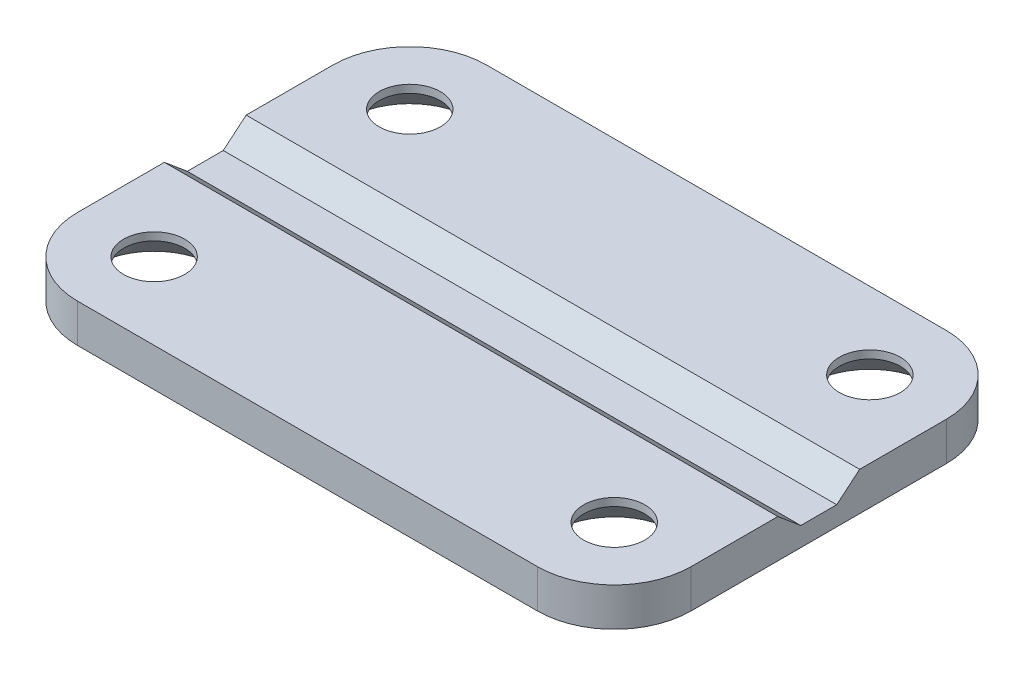
ISO-10303-21;
HEADER;
FILE_DESCRIPTION(('STEP AP214'),'2;1');
FILE_NAME('part.step','',(''),(''),'','','');
FILE_SCHEMA(('AUTOMOTIVE_DESIGN { 1 0 10303 214 1 1 1 1 }'));
ENDSEC;
DATA;
#1=APPLICATION_CONTEXT('core data for automotive mechanical design processes');
#2=APPLICATION_PROTOCOL_DEFINITION('international standard','automotive_design',2000,#1);
#3=PRODUCT_CONTEXT('',#1,'mechanical');
#4=PRODUCT('Part','Part','',(#3));
#5=PRODUCT_RELATED_PRODUCT_CATEGORY('part','',(#4));
#6=PRODUCT_DEFINITION_FORMATION('','',#4);
#7=PRODUCT_DEFINITION_CONTEXT('part definition',#1,'design');
#8=PRODUCT_DEFINITION('design','',#6,#7);
#9=PRODUCT_DEFINITION_SHAPE('','',#8);
#10=(LENGTH_UNIT() NAMED_UNIT(*) SI_UNIT(.MILLI.,.METRE.));
#11=(NAMED_UNIT(*) PLANE_ANGLE_UNIT() SI_UNIT($,.RADIAN.));
#12=(NAMED_UNIT(*) SI_UNIT($,.STERADIAN.) SOLID_ANGLE_UNIT());
#13=UNCERTAINTY_MEASURE_WITH_UNIT(LENGTH_MEASURE(1.E-05),#10,'distance_accuracy_value','');
#14=(GEOMETRIC_REPRESENTATION_CONTEXT(3) GLOBAL_UNCERTAINTY_ASSIGNED_CONTEXT((#13)) GLOBAL_UNIT_ASSIGNED_CONTEXT((#10,
#11,#12)) REPRESENTATION_CONTEXT('',''));
#15=CARTESIAN_POINT('',(0.,0.,0.));
#16=DIRECTION('',(0.,0.,1.));
#17=DIRECTION('',(1.,0.,0.));
#18=AXIS2_PLACEMENT_3D('',#15,#16,#17);
#19=CARTESIAN_POINT('',(19.05,0.,12.7));
#20=DIRECTION('',(0.,0.,-1.));
#21=DIRECTION('',(-1.,0.,0.));
#22=AXIS2_PLACEMENT_3D('',#19,#20,#21);
#23=PLANE('',#22);
#24=DIRECTION('',(-1.,0.,0.));
#25=VECTOR('',#24,1.);
#26=CARTESIAN_POINT('',(19.05,0.,12.7));
#27=LINE('',#26,#25);
#28=CARTESIAN_POINT('',(14.2748,0.,12.7));
#29=VERTEX_POINT('',#28);
#30=CARTESIAN_POINT('',(-14.2748,0.,12.7));
#31=VERTEX_POINT('',#30);
#32=EDGE_CURVE('E187',#29,#31,#27,.T.);
#33=ORIENTED_EDGE('',*,*,#32,.F.);
#34=DIRECTION('',(0.,-1.,0.));
#35=VECTOR('',#34,1.);
#36=CARTESIAN_POINT('',(14.2748,0.,12.7));
#37=LINE('',#36,#35);
#38=CARTESIAN_POINT('',(14.2748,2.3876,12.7));
#39=VERTEX_POINT('',#38);
#40=EDGE_CURVE('E214',#29,#39,#37,.F.);
#41=ORIENTED_EDGE('',*,*,#40,.T.);
#42=DIRECTION('',(-1.,0.,0.));
#43=VECTOR('',#42,1.);
#44=CARTESIAN_POINT('',(19.05,2.3876,12.7));
#45=LINE('',#44,#43);
#46=CARTESIAN_POINT('',(-14.2748,2.3876,12.7));
#47=VERTEX_POINT('',#46);
#48=EDGE_CURVE('E160',#39,#47,#45,.T.);
#49=ORIENTED_EDGE('',*,*,#48,.T.);
#50=DIRECTION('',(0.,-1.,0.));
#51=VECTOR('',#50,1.);
#52=CARTESIAN_POINT('',(-14.2748,0.,12.7));
#53=LINE('',#52,#51);
#54=EDGE_CURVE('E211',#47,#31,#53,.T.);
#55=ORIENTED_EDGE('',*,*,#54,.T.);
#56=EDGE_LOOP('',(#33,#41,#49,#55));
#57=FACE_BOUND('',#56,.T.);
#58=ADVANCED_FACE('F32',(#57),#23,.F.);
#59=CARTESIAN_POINT('',(19.05,0.,12.7));
#60=DIRECTION('',(0.,1.,0.));
#61=DIRECTION('',(0.,0.,1.));
#62=AXIS2_PLACEMENT_3D('',#59,#60,#61);
#63=PLANE('',#62);
#64=CARTESIAN_POINT('',(-14.2875,0.,-7.9375));
#65=DIRECTION('',(0.,1.,0.));
#66=DIRECTION('',(0.,0.,1.));
#67=AXIS2_PLACEMENT_3D('',#64,#65,#66);
#68=CIRCLE('',#67,3.7973);
#69=CARTESIAN_POINT('',(-14.2875,0.,-4.1402));
#70=VERTEX_POINT('',#69);
#71=EDGE_CURVE('E231',#70,#70,#68,.T.);
#72=ORIENTED_EDGE('',*,*,#71,.T.);
#73=EDGE_LOOP('',(#72));
#74=FACE_BOUND('',#73,.T.);
#75=CARTESIAN_POINT('',(14.2875,0.,-7.9375));
#76=DIRECTION('',(0.,1.,0.));
#77=DIRECTION('',(0.,0.,1.));
#78=AXIS2_PLACEMENT_3D('',#75,#76,#77);
#79=CIRCLE('',#78,3.7973);
#80=CARTESIAN_POINT('',(14.2875,0.,-4.1402));
#81=VERTEX_POINT('',#80);
#82=EDGE_CURVE('E228',#81,#81,#79,.T.);
#83=ORIENTED_EDGE('',*,*,#82,.T.);
#84=EDGE_LOOP('',(#83));
#85=FACE_BOUND('',#84,.T.);
#86=CARTESIAN_POINT('',(14.2875,0.,7.9375));
#87=DIRECTION('',(0.,1.,0.));
#88=DIRECTION('',(0.,0.,1.));
#89=AXIS2_PLACEMENT_3D('',#86,#87,#88);
#90=CIRCLE('',#89,3.7973);
#91=CARTESIAN_POINT('',(14.2875,0.,11.7348));
#92=VERTEX_POINT('',#91);
#93=EDGE_CURVE('E225',#92,#92,#90,.T.);
#94=ORIENTED_EDGE('',*,*,#93,.T.);
#95=EDGE_LOOP('',(#94));
#96=FACE_BOUND('',#95,.T.);
#97=CARTESIAN_POINT('',(-14.2875,0.,7.9375));
#98=DIRECTION('',(0.,1.,0.));
#99=DIRECTION('',(0.,0.,1.));
#100=AXIS2_PLACEMENT_3D('',#97,#98,#99);
#101=CIRCLE('',#100,3.7973);
#102=CARTESIAN_POINT('',(-14.2875,0.,11.7348));
#103=VERTEX_POINT('',#102);
#104=EDGE_CURVE('E222',#103,#103,#101,.T.);
#105=ORIENTED_EDGE('',*,*,#104,.T.);
#106=EDGE_LOOP('',(#105));
#107=FACE_BOUND('',#106,.T.);
#108=DIRECTION('',(-1.,0.,0.));
#109=VECTOR('',#108,1.);
#110=CARTESIAN_POINT('',(19.05,0.,-12.7));
#111=LINE('',#110,#109);
#112=CARTESIAN_POINT('',(14.2748,0.,-12.7));
#113=VERTEX_POINT('',#112);
#114=CARTESIAN_POINT('',(-14.2748,0.,-12.7));
#115=VERTEX_POINT('',#114);
#116=EDGE_CURVE('E184',#113,#115,#111,.T.);
#117=ORIENTED_EDGE('',*,*,#116,.F.);
#118=CARTESIAN_POINT('',(14.2748,0.,-7.9248));
#119=DIRECTION('',(0.,1.,0.));
#120=DIRECTION('',(0.,0.,1.));
#121=AXIS2_PLACEMENT_3D('',#118,#119,#120);
#122=CIRCLE('',#121,4.7752);
#123=CARTESIAN_POINT('',(19.05,0.,-7.9248));
#124=VERTEX_POINT('',#123);
#125=EDGE_CURVE('E209',#113,#124,#122,.F.);
#126=ORIENTED_EDGE('',*,*,#125,.T.);
#127=DIRECTION('',(0.,0.,-1.));
#128=VECTOR('',#127,1.);
#129=CARTESIAN_POINT('',(19.05,0.,12.7));
#130=LINE('',#129,#128);
#131=CARTESIAN_POINT('',(19.05,0.,7.9248));
#132=VERTEX_POINT('',#131);
#133=EDGE_CURVE('E134',#132,#124,#130,.T.);
#134=ORIENTED_EDGE('',*,*,#133,.F.);
#135=CARTESIAN_POINT('',(14.2748,0.,7.9248));
#136=DIRECTION('',(0.,1.,0.));
#137=DIRECTION('',(0.,0.,1.));
#138=AXIS2_PLACEMENT_3D('',#135,#136,#137);
#139=CIRCLE('',#138,4.7752);
#140=EDGE_CURVE('E207',#132,#29,#139,.F.);
#141=ORIENTED_EDGE('',*,*,#140,.T.);
#142=ORIENTED_EDGE('',*,*,#32,.T.);
#143=CARTESIAN_POINT('',(-14.2748,0.,7.9248));
#144=DIRECTION('',(0.,1.,0.));
#145=DIRECTION('',(0.,0.,1.));
#146=AXIS2_PLACEMENT_3D('',#143,#144,#145);
#147=CIRCLE('',#146,4.7752);
#148=CARTESIAN_POINT('',(-19.05,0.,7.9248));
#149=VERTEX_POINT('',#148);
#150=EDGE_CURVE('E203',#31,#149,#147,.F.);
#151=ORIENTED_EDGE('',*,*,#150,.T.);
#152=DIRECTION('',(0.,0.,-1.));
#153=VECTOR('',#152,1.);
#154=CARTESIAN_POINT('',(-19.05,0.,12.7));
#155=LINE('',#154,#153);
#156=CARTESIAN_POINT('',(-19.05,0.,-7.9248));
#157=VERTEX_POINT('',#156);
#158=EDGE_CURVE('E161',#149,#157,#155,.T.);
#159=ORIENTED_EDGE('',*,*,#158,.T.);
#160=CARTESIAN_POINT('',(-14.2748,0.,-7.9248));
#161=DIRECTION('',(0.,1.,0.));
#162=DIRECTION('',(0.,0.,1.));
#163=AXIS2_PLACEMENT_3D('',#160,#161,#162);
#164=CIRCLE('',#163,4.7752);
#165=EDGE_CURVE('E205',#157,#115,#164,.F.);
#166=ORIENTED_EDGE('',*,*,#165,.T.);
#167=EDGE_LOOP('',(#117,#126,#134,#141,#142,#151,#159,#166));
#168=FACE_BOUND('',#167,.T.);
#169=ADVANCED_FACE('F251',(#74,#85,#96,#107,#168),#63,.F.);
#170=CARTESIAN_POINT('',(19.05,0.,-12.7));
#171=DIRECTION('',(0.,0.,1.));
#172=DIRECTION('',(1.,0.,0.));
#173=AXIS2_PLACEMENT_3D('',#170,#171,#172);
#174=PLANE('',#173);
#175=DIRECTION('',(-1.,0.,0.));
#176=VECTOR('',#175,1.);
#177=CARTESIAN_POINT('',(19.05,2.3876,-12.7));
#178=LINE('',#177,#176);
#179=CARTESIAN_POINT('',(14.2748,2.3876,-12.7));
#180=VERTEX_POINT('',#179);
#181=CARTESIAN_POINT('',(-14.2748,2.3876,-12.7));
#182=VERTEX_POINT('',#181);
#183=EDGE_CURVE('E144',#180,#182,#178,.T.);
#184=ORIENTED_EDGE('',*,*,#183,.F.);
#185=DIRECTION('',(0.,1.,0.));
#186=VECTOR('',#185,1.);
#187=CARTESIAN_POINT('',(14.2748,0.,-12.7));
#188=LINE('',#187,#186);
#189=EDGE_CURVE('E201',#180,#113,#188,.F.);
#190=ORIENTED_EDGE('',*,*,#189,.T.);
#191=ORIENTED_EDGE('',*,*,#116,.T.);
#192=DIRECTION('',(0.,1.,0.));
#193=VECTOR('',#192,1.);
#194=CARTESIAN_POINT('',(-14.2748,2.3876,-12.7));
#195=LINE('',#194,#193);
#196=EDGE_CURVE('E198',#115,#182,#195,.T.);
#197=ORIENTED_EDGE('',*,*,#196,.T.);
#198=EDGE_LOOP('',(#184,#190,#191,#197));
#199=FACE_BOUND('',#198,.T.);
#200=ADVANCED_FACE('F254',(#199),#174,.F.);
#201=CARTESIAN_POINT('',(19.05,2.3876,-2.54));
#202=DIRECTION('',(0.,-1.,0.));
#203=DIRECTION('',(0.,0.,-1.));
#204=AXIS2_PLACEMENT_3D('',#201,#202,#203);
#205=PLANE('',#204);
#206=DIRECTION('',(0.,0.,1.));
#207=VECTOR('',#206,1.);
#208=CARTESIAN_POINT('',(19.05,2.3876,-2.54));
#209=LINE('',#208,#207);
#210=CARTESIAN_POINT('',(19.05,2.3876,-7.9248));
#211=VERTEX_POINT('',#210);
#212=CARTESIAN_POINT('',(19.05,2.3876,-2.54));
#213=VERTEX_POINT('',#212);
#214=EDGE_CURVE('E124',#211,#213,#209,.T.);
#215=ORIENTED_EDGE('',*,*,#214,.F.);
#216=CARTESIAN_POINT('',(14.2748,2.3876,-7.9248));
#217=DIRECTION('',(0.,-1.,0.));
#218=DIRECTION('',(0.,0.,-1.));
#219=AXIS2_PLACEMENT_3D('',#216,#217,#218);
#220=CIRCLE('',#219,4.7752);
#221=EDGE_CURVE('E196',#211,#180,#220,.F.);
#222=ORIENTED_EDGE('',*,*,#221,.T.);
#223=ORIENTED_EDGE('',*,*,#183,.T.);
#224=CARTESIAN_POINT('',(-14.2748,2.3876,-7.9248));
#225=DIRECTION('',(0.,-1.,0.));
#226=DIRECTION('',(0.,0.,-1.));
#227=AXIS2_PLACEMENT_3D('',#224,#225,#226);
#228=CIRCLE('',#227,4.7752);
#229=CARTESIAN_POINT('',(-19.05,2.3876,-7.9248));
#230=VERTEX_POINT('',#229);
#231=EDGE_CURVE('E194',#182,#230,#228,.F.);
#232=ORIENTED_EDGE('',*,*,#231,.T.);
#233=DIRECTION('',(0.,0.,1.));
#234=VECTOR('',#233,1.);
#235=CARTESIAN_POINT('',(-19.05,2.3876,-2.54));
#236=LINE('',#235,#234);
#237=CARTESIAN_POINT('',(-19.05,2.3876,-2.54));
#238=VERTEX_POINT('',#237);
#239=EDGE_CURVE('E141',#230,#238,#236,.T.);
#240=ORIENTED_EDGE('',*,*,#239,.T.);
#241=DIRECTION('',(-1.,0.,0.));
#242=VECTOR('',#241,1.);
#243=CARTESIAN_POINT('',(19.05,2.3876,-2.54));
#244=LINE('',#243,#242);
#245=EDGE_CURVE('E137',#213,#238,#244,.T.);
#246=ORIENTED_EDGE('',*,*,#245,.F.);
#247=EDGE_LOOP('',(#215,#222,#223,#232,#240,#246));
#248=FACE_BOUND('',#247,.T.);
#249=CARTESIAN_POINT('',(-14.2875,2.3876,-7.9375));
#250=DIRECTION('',(0.,1.,0.));
#251=DIRECTION('',(0.,0.,1.));
#252=AXIS2_PLACEMENT_3D('',#249,#250,#251);
#253=CIRCLE('',#252,1.89865);
#254=CARTESIAN_POINT('',(-14.2875,2.3876,-6.03885));
#255=VERTEX_POINT('',#254);
#256=EDGE_CURVE('E294',#255,#255,#253,.T.);
#257=ORIENTED_EDGE('',*,*,#256,.F.);
#258=EDGE_LOOP('',(#257));
#259=FACE_BOUND('',#258,.T.);
#260=CARTESIAN_POINT('',(14.2875,2.3876,-7.9375));
#261=DIRECTION('',(0.,1.,0.));
#262=DIRECTION('',(0.,0.,1.));
#263=AXIS2_PLACEMENT_3D('',#260,#261,#262);
#264=CIRCLE('',#263,1.89865);
#265=CARTESIAN_POINT('',(14.2875,2.3876,-6.03885));
#266=VERTEX_POINT('',#265);
#267=EDGE_CURVE('E300',#266,#266,#264,.T.);
#268=ORIENTED_EDGE('',*,*,#267,.F.);
#269=EDGE_LOOP('',(#268));
#270=FACE_BOUND('',#269,.T.);
#271=ADVANCED_FACE('F138',(#248,#259,#270),#205,.F.);
#272=CARTESIAN_POINT('',(19.05,1.1938,-1.11728456116104));
#273=DIRECTION('',(0.,-0.766044443118977,-0.642787609686541));
#274=DIRECTION('',(0.,0.642787609686541,-0.766044443118977));
#275=AXIS2_PLACEMENT_3D('',#272,#273,#274);
#276=PLANE('',#275);
#277=DIRECTION('',(0.,-0.642787609686541,0.766044443118977));
#278=VECTOR('',#277,1.);
#279=CARTESIAN_POINT('',(-19.05,1.1938,-1.11728456116104));
#280=LINE('',#279,#278);
#281=CARTESIAN_POINT('',(-19.05,1.1938,-1.11728456116104));
#282=VERTEX_POINT('',#281);
#283=EDGE_CURVE('E166',#238,#282,#280,.T.);
#284=ORIENTED_EDGE('',*,*,#283,.T.);
#285=DIRECTION('',(-1.,0.,0.));
#286=VECTOR('',#285,1.);
#287=CARTESIAN_POINT('',(19.05,1.1938,-1.11728456116104));
#288=LINE('',#287,#286);
#289=CARTESIAN_POINT('',(19.05,1.1938,-1.11728456116104));
#290=VERTEX_POINT('',#289);
#291=EDGE_CURVE('E145',#290,#282,#288,.T.);
#292=ORIENTED_EDGE('',*,*,#291,.F.);
#293=DIRECTION('',(0.,-0.642787609686541,0.766044443118977));
#294=VECTOR('',#293,1.);
#295=CARTESIAN_POINT('',(19.05,1.1938,-1.11728456116104));
#296=LINE('',#295,#294);
#297=EDGE_CURVE('E129',#213,#290,#296,.T.);
#298=ORIENTED_EDGE('',*,*,#297,.F.);
#299=ORIENTED_EDGE('',*,*,#245,.T.);
#300=EDGE_LOOP('',(#284,#292,#298,#299));
#301=FACE_BOUND('',#300,.T.);
#302=ADVANCED_FACE('F147',(#301),#276,.F.);
#303=CARTESIAN_POINT('',(19.05,1.1938,1.11728456116104));
#304=DIRECTION('',(0.,-1.,0.));
#305=DIRECTION('',(0.,0.,-1.));
#306=AXIS2_PLACEMENT_3D('',#303,#304,#305);
#307=PLANE('',#306);
#308=DIRECTION('',(0.,0.,1.));
#309=VECTOR('',#308,1.);
#310=CARTESIAN_POINT('',(-19.05,1.1938,1.11728456116104));
#311=LINE('',#310,#309);
#312=CARTESIAN_POINT('',(-19.05,1.1938,1.11728456116104));
#313=VERTEX_POINT('',#312);
#314=EDGE_CURVE('E168',#282,#313,#311,.T.);
#315=ORIENTED_EDGE('',*,*,#314,.T.);
#316=DIRECTION('',(-1.,0.,0.));
#317=VECTOR('',#316,1.);
#318=CARTESIAN_POINT('',(19.05,1.1938,1.11728456116104));
#319=LINE('',#318,#317);
#320=CARTESIAN_POINT('',(19.05,1.1938,1.11728456116104));
#321=VERTEX_POINT('',#320);
#322=EDGE_CURVE('E178',#321,#313,#319,.T.);
#323=ORIENTED_EDGE('',*,*,#322,.F.);
#324=DIRECTION('',(0.,0.,1.));
#325=VECTOR('',#324,1.);
#326=CARTESIAN_POINT('',(19.05,1.1938,1.11728456116104));
#327=LINE('',#326,#325);
#328=EDGE_CURVE('E150',#290,#321,#327,.T.);
#329=ORIENTED_EDGE('',*,*,#328,.F.);
#330=ORIENTED_EDGE('',*,*,#291,.T.);
#331=EDGE_LOOP('',(#315,#323,#329,#330));
#332=FACE_BOUND('',#331,.T.);
#333=ADVANCED_FACE('F276',(#332),#307,.F.);
#334=CARTESIAN_POINT('',(19.05,2.3876,2.54));
#335=DIRECTION('',(0.,-0.766044443118977,0.642787609686541));
#336=DIRECTION('',(0.,-0.642787609686541,-0.766044443118977));
#337=AXIS2_PLACEMENT_3D('',#334,#335,#336);
#338=PLANE('',#337);
#339=DIRECTION('',(0.,0.642787609686541,0.766044443118977));
#340=VECTOR('',#339,1.);
#341=CARTESIAN_POINT('',(-19.05,2.3876,2.54));
#342=LINE('',#341,#340);
#343=CARTESIAN_POINT('',(-19.05,2.3876,2.54));
#344=VERTEX_POINT('',#343);
#345=EDGE_CURVE('E170',#313,#344,#342,.T.);
#346=ORIENTED_EDGE('',*,*,#345,.T.);
#347=DIRECTION('',(-1.,0.,0.));
#348=VECTOR('',#347,1.);
#349=CARTESIAN_POINT('',(19.05,2.3876,2.54));
#350=LINE('',#349,#348);
#351=CARTESIAN_POINT('',(19.05,2.3876,2.54));
#352=VERTEX_POINT('',#351);
#353=EDGE_CURVE('E175',#352,#344,#350,.T.);
#354=ORIENTED_EDGE('',*,*,#353,.F.);
#355=DIRECTION('',(0.,0.642787609686541,0.766044443118977));
#356=VECTOR('',#355,1.);
#357=CARTESIAN_POINT('',(19.05,2.3876,2.54));
#358=LINE('',#357,#356);
#359=EDGE_CURVE('E152',#321,#352,#358,.T.);
#360=ORIENTED_EDGE('',*,*,#359,.F.);
#361=ORIENTED_EDGE('',*,*,#322,.T.);
#362=EDGE_LOOP('',(#346,#354,#360,#361));
#363=FACE_BOUND('',#362,.T.);
#364=ADVANCED_FACE('F283',(#363),#338,.F.);
#365=CARTESIAN_POINT('',(19.05,2.3876,12.7));
#366=DIRECTION('',(0.,-1.,0.));
#367=DIRECTION('',(0.,0.,-1.));
#368=AXIS2_PLACEMENT_3D('',#365,#366,#367);
#369=PLANE('',#368);
#370=ORIENTED_EDGE('',*,*,#48,.F.);
#371=CARTESIAN_POINT('',(14.2748,2.3876,7.9248));
#372=DIRECTION('',(0.,-1.,0.));
#373=DIRECTION('',(0.,0.,-1.));
#374=AXIS2_PLACEMENT_3D('',#371,#372,#373);
#375=CIRCLE('',#374,4.7752);
#376=CARTESIAN_POINT('',(19.05,2.3876,7.9248));
#377=VERTEX_POINT('',#376);
#378=EDGE_CURVE('E217',#39,#377,#375,.F.);
#379=ORIENTED_EDGE('',*,*,#378,.T.);
#380=DIRECTION('',(0.,0.,1.));
#381=VECTOR('',#380,1.);
#382=CARTESIAN_POINT('',(19.05,2.3876,12.7));
#383=LINE('',#382,#381);
#384=EDGE_CURVE('E157',#352,#377,#383,.T.);
#385=ORIENTED_EDGE('',*,*,#384,.F.);
#386=ORIENTED_EDGE('',*,*,#353,.T.);
#387=DIRECTION('',(0.,0.,1.));
#388=VECTOR('',#387,1.);
#389=CARTESIAN_POINT('',(-19.05,2.3876,12.7));
#390=LINE('',#389,#388);
#391=CARTESIAN_POINT('',(-19.05,2.3876,7.9248));
#392=VERTEX_POINT('',#391);
#393=EDGE_CURVE('E172',#344,#392,#390,.T.);
#394=ORIENTED_EDGE('',*,*,#393,.T.);
#395=CARTESIAN_POINT('',(-14.2748,2.3876,7.9248));
#396=DIRECTION('',(0.,-1.,0.));
#397=DIRECTION('',(0.,0.,-1.));
#398=AXIS2_PLACEMENT_3D('',#395,#396,#397);
#399=CIRCLE('',#398,4.7752);
#400=EDGE_CURVE('E54',#392,#47,#399,.F.);
#401=ORIENTED_EDGE('',*,*,#400,.T.);
#402=EDGE_LOOP('',(#370,#379,#385,#386,#394,#401));
#403=FACE_BOUND('',#402,.T.);
#404=CARTESIAN_POINT('',(-14.2875,2.3876,7.9375));
#405=DIRECTION('',(0.,1.,0.));
#406=DIRECTION('',(0.,0.,1.));
#407=AXIS2_PLACEMENT_3D('',#404,#405,#406);
#408=CIRCLE('',#407,1.89865);
#409=CARTESIAN_POINT('',(-14.2875,2.3876,9.83615));
#410=VERTEX_POINT('',#409);
#411=EDGE_CURVE('E164',#410,#410,#408,.T.);
#412=ORIENTED_EDGE('',*,*,#411,.F.);
#413=EDGE_LOOP('',(#412));
#414=FACE_BOUND('',#413,.T.);
#415=CARTESIAN_POINT('',(14.2875,2.3876,7.9375));
#416=DIRECTION('',(0.,1.,0.));
#417=DIRECTION('',(0.,0.,1.));
#418=AXIS2_PLACEMENT_3D('',#415,#416,#417);
#419=CIRCLE('',#418,1.89865);
#420=CARTESIAN_POINT('',(14.2875,2.3876,9.83615));
#421=VERTEX_POINT('',#420);
#422=EDGE_CURVE('E297',#421,#421,#419,.T.);
#423=ORIENTED_EDGE('',*,*,#422,.F.);
#424=EDGE_LOOP('',(#423));
#425=FACE_BOUND('',#424,.T.);
#426=ADVANCED_FACE('F284',(#403,#414,#425),#369,.F.);
#427=CARTESIAN_POINT('',(19.05,2.3876,12.7));
#428=DIRECTION('',(-1.,0.,0.));
#429=DIRECTION('',(0.,0.,1.));
#430=AXIS2_PLACEMENT_3D('',#427,#428,#429);
#431=PLANE('',#430);
#432=ORIENTED_EDGE('',*,*,#133,.T.);
#433=DIRECTION('',(0.,1.,0.));
#434=VECTOR('',#433,1.);
#435=CARTESIAN_POINT('',(19.05,2.3876,-7.9248));
#436=LINE('',#435,#434);
#437=EDGE_CURVE('E132',#124,#211,#436,.T.);
#438=ORIENTED_EDGE('',*,*,#437,.T.);
#439=ORIENTED_EDGE('',*,*,#214,.T.);
#440=ORIENTED_EDGE('',*,*,#297,.T.);
#441=ORIENTED_EDGE('',*,*,#328,.T.);
#442=ORIENTED_EDGE('',*,*,#359,.T.);
#443=ORIENTED_EDGE('',*,*,#384,.T.);
#444=DIRECTION('',(0.,-1.,0.));
#445=VECTOR('',#444,1.);
#446=CARTESIAN_POINT('',(19.05,2.3876,7.9248));
#447=LINE('',#446,#445);
#448=EDGE_CURVE('E190',#377,#132,#447,.T.);
#449=ORIENTED_EDGE('',*,*,#448,.T.);
#450=EDGE_LOOP('',(#432,#438,#439,#440,#441,#442,#443,#449));
#451=FACE_BOUND('',#450,.T.);
#452=ADVANCED_FACE('F127',(#451),#431,.F.);
#453=CARTESIAN_POINT('',(-19.05,2.3876,12.7));
#454=DIRECTION('',(-1.,0.,0.));
#455=DIRECTION('',(0.,0.,1.));
#456=AXIS2_PLACEMENT_3D('',#453,#454,#455);
#457=PLANE('',#456);
#458=ORIENTED_EDGE('',*,*,#239,.F.);
#459=DIRECTION('',(0.,1.,0.));
#460=VECTOR('',#459,1.);
#461=CARTESIAN_POINT('',(-19.05,0.,-7.9248));
#462=LINE('',#461,#460);
#463=EDGE_CURVE('E220',#230,#157,#462,.F.);
#464=ORIENTED_EDGE('',*,*,#463,.T.);
#465=ORIENTED_EDGE('',*,*,#158,.F.);
#466=DIRECTION('',(0.,-1.,0.));
#467=VECTOR('',#466,1.);
#468=CARTESIAN_POINT('',(-19.05,2.3876,7.9248));
#469=LINE('',#468,#467);
#470=EDGE_CURVE('E47',#149,#392,#469,.F.);
#471=ORIENTED_EDGE('',*,*,#470,.T.);
#472=ORIENTED_EDGE('',*,*,#393,.F.);
#473=ORIENTED_EDGE('',*,*,#345,.F.);
#474=ORIENTED_EDGE('',*,*,#314,.F.);
#475=ORIENTED_EDGE('',*,*,#283,.F.);
#476=EDGE_LOOP('',(#458,#464,#465,#471,#472,#473,#474,#475));
#477=FACE_BOUND('',#476,.T.);
#478=ADVANCED_FACE('F272',(#477),#457,.T.);
#479=CARTESIAN_POINT('',(-14.2875,2.3876,-7.9375));
#480=DIRECTION('',(0.,1.,0.));
#481=DIRECTION('',(0.,0.,1.));
#482=AXIS2_PLACEMENT_3D('',#479,#480,#481);
#483=CYLINDRICAL_SURFACE('',#482,1.89865);
#484=CARTESIAN_POINT('',(-14.2875,1.89865000000001,-7.9375));
#485=DIRECTION('',(0.,1.,0.));
#486=DIRECTION('',(0.,0.,1.));
#487=AXIS2_PLACEMENT_3D('',#484,#485,#486);
#488=CIRCLE('',#487,1.89865);
#489=CARTESIAN_POINT('',(-14.2875,1.89865000000001,-6.03885));
#490=VERTEX_POINT('',#489);
#491=EDGE_CURVE('E234',#490,#490,#488,.F.);
#492=ORIENTED_EDGE('',*,*,#491,.T.);
#493=EDGE_LOOP('',(#492));
#494=FACE_BOUND('',#493,.T.);
#495=ORIENTED_EDGE('',*,*,#256,.T.);
#496=EDGE_LOOP('',(#495));
#497=FACE_BOUND('',#496,.T.);
#498=ADVANCED_FACE('F352',(#494,#497),#483,.F.);
#499=CARTESIAN_POINT('',(14.2875,2.3876,7.9375));
#500=DIRECTION('',(0.,1.,0.));
#501=DIRECTION('',(0.,0.,1.));
#502=AXIS2_PLACEMENT_3D('',#499,#500,#501);
#503=CYLINDRICAL_SURFACE('',#502,1.89865);
#504=CARTESIAN_POINT('',(14.2875,1.89865000000001,7.9375));
#505=DIRECTION('',(0.,1.,0.));
#506=DIRECTION('',(0.,0.,1.));
#507=AXIS2_PLACEMENT_3D('',#504,#505,#506);
#508=CIRCLE('',#507,1.89865);
#509=CARTESIAN_POINT('',(14.2875,1.89865000000001,9.83615));
#510=VERTEX_POINT('',#509);
#511=EDGE_CURVE('E40',#510,#510,#508,.F.);
#512=ORIENTED_EDGE('',*,*,#511,.T.);
#513=EDGE_LOOP('',(#512));
#514=FACE_BOUND('',#513,.T.);
#515=ORIENTED_EDGE('',*,*,#422,.T.);
#516=EDGE_LOOP('',(#515));
#517=FACE_BOUND('',#516,.T.);
#518=ADVANCED_FACE('F242',(#514,#517),#503,.F.);
#519=CARTESIAN_POINT('',(14.2875,2.3876,-7.9375));
#520=DIRECTION('',(0.,1.,0.));
#521=DIRECTION('',(0.,0.,1.));
#522=AXIS2_PLACEMENT_3D('',#519,#520,#521);
#523=CYLINDRICAL_SURFACE('',#522,1.89865);
#524=CARTESIAN_POINT('',(14.2875,1.89865000000001,-7.9375));
#525=DIRECTION('',(0.,1.,0.));
#526=DIRECTION('',(0.,0.,1.));
#527=AXIS2_PLACEMENT_3D('',#524,#525,#526);
#528=CIRCLE('',#527,1.89865);
#529=CARTESIAN_POINT('',(14.2875,1.89865000000001,-6.03885));
#530=VERTEX_POINT('',#529);
#531=EDGE_CURVE('E237',#530,#530,#528,.F.);
#532=ORIENTED_EDGE('',*,*,#531,.T.);
#533=EDGE_LOOP('',(#532));
#534=FACE_BOUND('',#533,.T.);
#535=ORIENTED_EDGE('',*,*,#267,.T.);
#536=EDGE_LOOP('',(#535));
#537=FACE_BOUND('',#536,.T.);
#538=ADVANCED_FACE('F304',(#534,#537),#523,.F.);
#539=CARTESIAN_POINT('',(-14.2875,2.3876,7.9375));
#540=DIRECTION('',(0.,1.,0.));
#541=DIRECTION('',(0.,0.,1.));
#542=AXIS2_PLACEMENT_3D('',#539,#540,#541);
#543=CYLINDRICAL_SURFACE('',#542,1.89865);
#544=CARTESIAN_POINT('',(-14.2875,1.89865000000001,7.9375));
#545=DIRECTION('',(0.,1.,0.));
#546=DIRECTION('',(0.,0.,1.));
#547=AXIS2_PLACEMENT_3D('',#544,#545,#546);
#548=CIRCLE('',#547,1.89865);
#549=CARTESIAN_POINT('',(-14.2875,1.89865000000001,9.83615));
#550=VERTEX_POINT('',#549);
#551=EDGE_CURVE('E11',#550,#550,#548,.F.);
#552=ORIENTED_EDGE('',*,*,#551,.T.);
#553=EDGE_LOOP('',(#552));
#554=FACE_BOUND('',#553,.T.);
#555=ORIENTED_EDGE('',*,*,#411,.T.);
#556=EDGE_LOOP('',(#555));
#557=FACE_BOUND('',#556,.T.);
#558=ADVANCED_FACE('F322',(#554,#557),#543,.F.);
#559=CARTESIAN_POINT('',(14.2748,2.3876,-7.9248));
#560=DIRECTION('',(0.,1.,0.));
#561=DIRECTION('',(0.,0.,1.));
#562=AXIS2_PLACEMENT_3D('',#559,#560,#561);
#563=CYLINDRICAL_SURFACE('',#562,4.7752);
#564=ORIENTED_EDGE('',*,*,#125,.F.);
#565=ORIENTED_EDGE('',*,*,#189,.F.);
#566=ORIENTED_EDGE('',*,*,#221,.F.);
#567=ORIENTED_EDGE('',*,*,#437,.F.);
#568=EDGE_LOOP('',(#564,#565,#566,#567));
#569=FACE_BOUND('',#568,.T.);
#570=ADVANCED_FACE('F267',(#569),#563,.T.);
#571=CARTESIAN_POINT('',(14.2748,2.3876,7.9248));
#572=DIRECTION('',(0.,-1.,0.));
#573=DIRECTION('',(0.,0.,-1.));
#574=AXIS2_PLACEMENT_3D('',#571,#572,#573);
#575=CYLINDRICAL_SURFACE('',#574,4.7752);
#576=ORIENTED_EDGE('',*,*,#378,.F.);
#577=ORIENTED_EDGE('',*,*,#40,.F.);
#578=ORIENTED_EDGE('',*,*,#140,.F.);
#579=ORIENTED_EDGE('',*,*,#448,.F.);
#580=EDGE_LOOP('',(#576,#577,#578,#579));
#581=FACE_BOUND('',#580,.T.);
#582=ADVANCED_FACE('F289',(#581),#575,.T.);
#583=CARTESIAN_POINT('',(-14.2748,0.,-7.9248));
#584=DIRECTION('',(0.,-1.,0.));
#585=DIRECTION('',(0.,0.,-1.));
#586=AXIS2_PLACEMENT_3D('',#583,#584,#585);
#587=CYLINDRICAL_SURFACE('',#586,4.7752);
#588=ORIENTED_EDGE('',*,*,#165,.F.);
#589=ORIENTED_EDGE('',*,*,#463,.F.);
#590=ORIENTED_EDGE('',*,*,#231,.F.);
#591=ORIENTED_EDGE('',*,*,#196,.F.);
#592=EDGE_LOOP('',(#588,#589,#590,#591));
#593=FACE_BOUND('',#592,.T.);
#594=ADVANCED_FACE('F270',(#593),#587,.T.);
#595=CARTESIAN_POINT('',(-14.2748,0.,7.9248));
#596=DIRECTION('',(0.,1.,0.));
#597=DIRECTION('',(0.,0.,1.));
#598=AXIS2_PLACEMENT_3D('',#595,#596,#597);
#599=CYLINDRICAL_SURFACE('',#598,4.7752);
#600=ORIENTED_EDGE('',*,*,#400,.F.);
#601=ORIENTED_EDGE('',*,*,#470,.F.);
#602=ORIENTED_EDGE('',*,*,#150,.F.);
#603=ORIENTED_EDGE('',*,*,#54,.F.);
#604=EDGE_LOOP('',(#600,#601,#602,#603));
#605=FACE_BOUND('',#604,.T.);
#606=ADVANCED_FACE('F327',(#605),#599,.T.);
#607=CARTESIAN_POINT('',(-14.2875,0.,-7.9375));
#608=DIRECTION('',(0.,-1.,0.));
#609=DIRECTION('',(0.,0.,-1.));
#610=AXIS2_PLACEMENT_3D('',#607,#608,#609);
#611=CONICAL_SURFACE('',#610,3.7973,0.785398163397446);
#612=ORIENTED_EDGE('',*,*,#491,.F.);
#613=EDGE_LOOP('',(#612));
#614=FACE_BOUND('',#613,.T.);
#615=ORIENTED_EDGE('',*,*,#71,.F.);
#616=EDGE_LOOP('',(#615));
#617=FACE_BOUND('',#616,.T.);
#618=ADVANCED_FACE('F330',(#614,#617),#611,.F.);
#619=CARTESIAN_POINT('',(14.2875,0.,-7.9375));
#620=DIRECTION('',(0.,-1.,0.));
#621=DIRECTION('',(0.,0.,-1.));
#622=AXIS2_PLACEMENT_3D('',#619,#620,#621);
#623=CONICAL_SURFACE('',#622,3.7973,0.785398163397446);
#624=ORIENTED_EDGE('',*,*,#531,.F.);
#625=EDGE_LOOP('',(#624));
#626=FACE_BOUND('',#625,.T.);
#627=ORIENTED_EDGE('',*,*,#82,.F.);
#628=EDGE_LOOP('',(#627));
#629=FACE_BOUND('',#628,.T.);
#630=ADVANCED_FACE('F248',(#626,#629),#623,.F.);
#631=CARTESIAN_POINT('',(14.2875,0.,7.9375));
#632=DIRECTION('',(0.,-1.,0.));
#633=DIRECTION('',(0.,0.,-1.));
#634=AXIS2_PLACEMENT_3D('',#631,#632,#633);
#635=CONICAL_SURFACE('',#634,3.7973,0.785398163397446);
#636=ORIENTED_EDGE('',*,*,#511,.F.);
#637=EDGE_LOOP('',(#636));
#638=FACE_BOUND('',#637,.T.);
#639=ORIENTED_EDGE('',*,*,#93,.F.);
#640=EDGE_LOOP('',(#639));
#641=FACE_BOUND('',#640,.T.);
#642=ADVANCED_FACE('F245',(#638,#641),#635,.F.);
#643=CARTESIAN_POINT('',(-14.2875,0.,7.9375));
#644=DIRECTION('',(0.,-1.,0.));
#645=DIRECTION('',(0.,0.,-1.));
#646=AXIS2_PLACEMENT_3D('',#643,#644,#645);
#647=CONICAL_SURFACE('',#646,3.7973,0.785398163397446);
#648=ORIENTED_EDGE('',*,*,#551,.F.);
#649=EDGE_LOOP('',(#648));
#650=FACE_BOUND('',#649,.T.);
#651=ORIENTED_EDGE('',*,*,#104,.F.);
#652=EDGE_LOOP('',(#651));
#653=FACE_BOUND('',#652,.T.);
#654=ADVANCED_FACE('F34',(#650,#653),#647,.F.);
#655=CLOSED_SHELL('',(#58,#169,#200,#271,#302,#333,#364,#426,#452,#478,#498,#518,#538,#558,#570,
#582,#594,#606,#618,#630,#642,#654));
#656=MANIFOLD_SOLID_BREP('B2',#655);
#657=ADVANCED_BREP_SHAPE_REPRESENTATION('',(#18,#656),#14);
#658=SHAPE_DEFINITION_REPRESENTATION(#9,#657);
ENDSEC;
END-ISO-10303-21;
